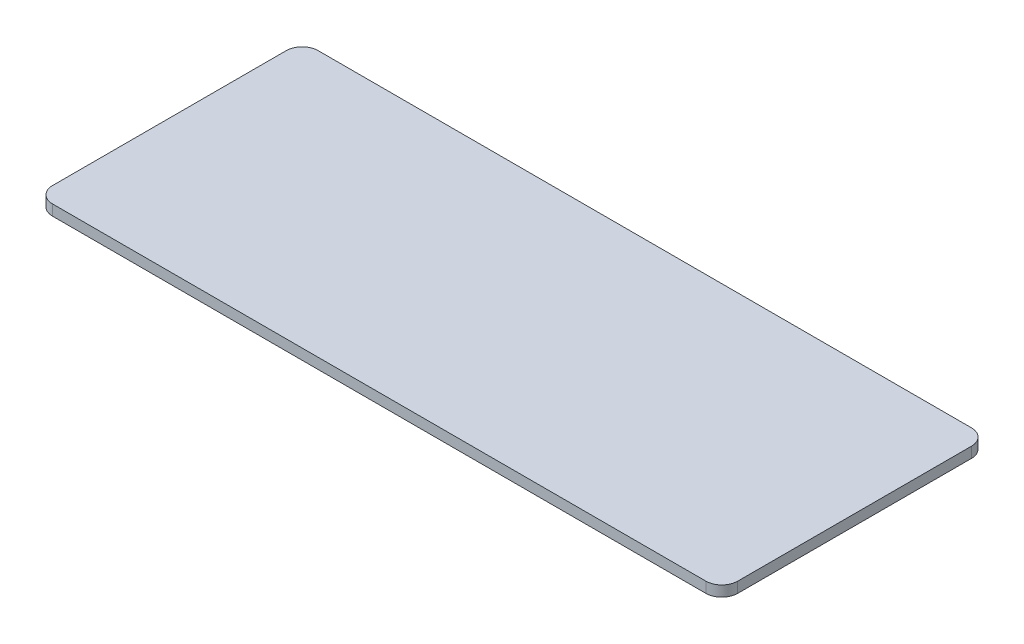
ISO-10303-21;
HEADER;
FILE_DESCRIPTION(('STEP AP214'),'2;1');
FILE_NAME('part.step','',(''),(''),'','','');
FILE_SCHEMA(('AUTOMOTIVE_DESIGN { 1 0 10303 214 1 1 1 1 }'));
ENDSEC;
DATA;
#1=APPLICATION_CONTEXT('core data for automotive mechanical design processes');
#2=APPLICATION_PROTOCOL_DEFINITION('international standard','automotive_design',2000,#1);
#3=PRODUCT_CONTEXT('',#1,'mechanical');
#4=PRODUCT('Part','Part','',(#3));
#5=PRODUCT_RELATED_PRODUCT_CATEGORY('part','',(#4));
#6=PRODUCT_DEFINITION_FORMATION('','',#4);
#7=PRODUCT_DEFINITION_CONTEXT('part definition',#1,'design');
#8=PRODUCT_DEFINITION('design','',#6,#7);
#9=PRODUCT_DEFINITION_SHAPE('','',#8);
#10=(LENGTH_UNIT() NAMED_UNIT(*) SI_UNIT(.MILLI.,.METRE.));
#11=(NAMED_UNIT(*) PLANE_ANGLE_UNIT() SI_UNIT($,.RADIAN.));
#12=(NAMED_UNIT(*) SI_UNIT($,.STERADIAN.) SOLID_ANGLE_UNIT());
#13=UNCERTAINTY_MEASURE_WITH_UNIT(LENGTH_MEASURE(1.E-05),#10,'distance_accuracy_value','');
#14=(GEOMETRIC_REPRESENTATION_CONTEXT(3) GLOBAL_UNCERTAINTY_ASSIGNED_CONTEXT((#13)) GLOBAL_UNIT_ASSIGNED_CONTEXT((#10,
#11,#12)) REPRESENTATION_CONTEXT('',''));
#15=CARTESIAN_POINT('',(0.,0.,0.));
#16=DIRECTION('',(0.,0.,1.));
#17=DIRECTION('',(1.,0.,0.));
#18=AXIS2_PLACEMENT_3D('',#15,#16,#17);
#19=CARTESIAN_POINT('',(64.5,2.,25.));
#20=DIRECTION('',(-1.,0.,0.));
#21=DIRECTION('',(0.,0.,1.));
#22=AXIS2_PLACEMENT_3D('',#19,#20,#21);
#23=PLANE('',#22);
#24=DIRECTION('',(0.,0.,-1.));
#25=VECTOR('',#24,1.);
#26=CARTESIAN_POINT('',(64.5,0.,25.));
#27=LINE('',#26,#25);
#28=CARTESIAN_POINT('',(64.5,0.,22.));
#29=VERTEX_POINT('',#28);
#30=CARTESIAN_POINT('',(64.5,0.,-22.));
#31=VERTEX_POINT('',#30);
#32=EDGE_CURVE('E128',#29,#31,#27,.T.);
#33=ORIENTED_EDGE('',*,*,#32,.T.);
#34=DIRECTION('',(0.,-1.,0.));
#35=VECTOR('',#34,1.);
#36=CARTESIAN_POINT('',(64.5,2.,-22.));
#37=LINE('',#36,#35);
#38=CARTESIAN_POINT('',(64.5,2.,-22.));
#39=VERTEX_POINT('',#38);
#40=EDGE_CURVE('E151',#31,#39,#37,.F.);
#41=ORIENTED_EDGE('',*,*,#40,.T.);
#42=DIRECTION('',(0.,0.,-1.));
#43=VECTOR('',#42,1.);
#44=CARTESIAN_POINT('',(64.5,2.,25.));
#45=LINE('',#44,#43);
#46=CARTESIAN_POINT('',(64.5,2.,22.));
#47=VERTEX_POINT('',#46);
#48=EDGE_CURVE('E126',#47,#39,#45,.T.);
#49=ORIENTED_EDGE('',*,*,#48,.F.);
#50=DIRECTION('',(0.,-1.,0.));
#51=VECTOR('',#50,1.);
#52=CARTESIAN_POINT('',(64.5,2.,22.));
#53=LINE('',#52,#51);
#54=EDGE_CURVE('E148',#47,#29,#53,.T.);
#55=ORIENTED_EDGE('',*,*,#54,.T.);
#56=EDGE_LOOP('',(#33,#41,#49,#55));
#57=FACE_BOUND('',#56,.T.);
#58=ADVANCED_FACE('F33',(#57),#23,.F.);
#59=CARTESIAN_POINT('',(-64.5,2.,-25.));
#60=DIRECTION('',(0.,0.,1.));
#61=DIRECTION('',(1.,0.,0.));
#62=AXIS2_PLACEMENT_3D('',#59,#60,#61);
#63=PLANE('',#62);
#64=DIRECTION('',(-1.,0.,0.));
#65=VECTOR('',#64,1.);
#66=CARTESIAN_POINT('',(-64.5,0.,-25.));
#67=LINE('',#66,#65);
#68=CARTESIAN_POINT('',(61.5,0.,-25.));
#69=VERTEX_POINT('',#68);
#70=CARTESIAN_POINT('',(-61.5,0.,-25.));
#71=VERTEX_POINT('',#70);
#72=EDGE_CURVE('E124',#69,#71,#67,.T.);
#73=ORIENTED_EDGE('',*,*,#72,.T.);
#74=DIRECTION('',(0.,-1.,0.));
#75=VECTOR('',#74,1.);
#76=CARTESIAN_POINT('',(-61.5,2.,-25.));
#77=LINE('',#76,#75);
#78=CARTESIAN_POINT('',(-61.5,2.,-25.));
#79=VERTEX_POINT('',#78);
#80=EDGE_CURVE('E103',#71,#79,#77,.F.);
#81=ORIENTED_EDGE('',*,*,#80,.T.);
#82=DIRECTION('',(-1.,0.,0.));
#83=VECTOR('',#82,1.);
#84=CARTESIAN_POINT('',(-64.5,2.,-25.));
#85=LINE('',#84,#83);
#86=CARTESIAN_POINT('',(61.5,2.,-25.));
#87=VERTEX_POINT('',#86);
#88=EDGE_CURVE('E167',#87,#79,#85,.T.);
#89=ORIENTED_EDGE('',*,*,#88,.F.);
#90=DIRECTION('',(0.,-1.,0.));
#91=VECTOR('',#90,1.);
#92=CARTESIAN_POINT('',(61.5,2.,-25.));
#93=LINE('',#92,#91);
#94=EDGE_CURVE('E108',#87,#69,#93,.T.);
#95=ORIENTED_EDGE('',*,*,#94,.T.);
#96=EDGE_LOOP('',(#73,#81,#89,#95));
#97=FACE_BOUND('',#96,.T.);
#98=ADVANCED_FACE('F184',(#97),#63,.F.);
#99=CARTESIAN_POINT('',(-64.5,2.,25.));
#100=DIRECTION('',(1.,0.,0.));
#101=DIRECTION('',(0.,0.,-1.));
#102=AXIS2_PLACEMENT_3D('',#99,#100,#101);
#103=PLANE('',#102);
#104=DIRECTION('',(0.,0.,1.));
#105=VECTOR('',#104,1.);
#106=CARTESIAN_POINT('',(-64.5,2.,25.));
#107=LINE('',#106,#105);
#108=CARTESIAN_POINT('',(-64.5,2.,-22.));
#109=VERTEX_POINT('',#108);
#110=CARTESIAN_POINT('',(-64.5,2.,22.));
#111=VERTEX_POINT('',#110);
#112=EDGE_CURVE('E117',#109,#111,#107,.T.);
#113=ORIENTED_EDGE('',*,*,#112,.F.);
#114=DIRECTION('',(0.,-1.,0.));
#115=VECTOR('',#114,1.);
#116=CARTESIAN_POINT('',(-64.5,2.,-22.));
#117=LINE('',#116,#115);
#118=CARTESIAN_POINT('',(-64.5,0.,-22.));
#119=VERTEX_POINT('',#118);
#120=EDGE_CURVE('E102',#109,#119,#117,.T.);
#121=ORIENTED_EDGE('',*,*,#120,.T.);
#122=DIRECTION('',(0.,0.,1.));
#123=VECTOR('',#122,1.);
#124=CARTESIAN_POINT('',(-64.5,0.,25.));
#125=LINE('',#124,#123);
#126=CARTESIAN_POINT('',(-64.5,0.,22.));
#127=VERTEX_POINT('',#126);
#128=EDGE_CURVE('E115',#119,#127,#125,.T.);
#129=ORIENTED_EDGE('',*,*,#128,.T.);
#130=DIRECTION('',(0.,-1.,0.));
#131=VECTOR('',#130,1.);
#132=CARTESIAN_POINT('',(-64.5,2.,22.));
#133=LINE('',#132,#131);
#134=EDGE_CURVE('E119',#127,#111,#133,.F.);
#135=ORIENTED_EDGE('',*,*,#134,.T.);
#136=EDGE_LOOP('',(#113,#121,#129,#135));
#137=FACE_BOUND('',#136,.T.);
#138=ADVANCED_FACE('F114',(#137),#103,.F.);
#139=CARTESIAN_POINT('',(-64.5,2.,25.));
#140=DIRECTION('',(0.,0.,-1.));
#141=DIRECTION('',(-1.,0.,0.));
#142=AXIS2_PLACEMENT_3D('',#139,#140,#141);
#143=PLANE('',#142);
#144=DIRECTION('',(1.,0.,0.));
#145=VECTOR('',#144,1.);
#146=CARTESIAN_POINT('',(-64.5,0.,25.));
#147=LINE('',#146,#145);
#148=CARTESIAN_POINT('',(-61.5,0.,25.));
#149=VERTEX_POINT('',#148);
#150=CARTESIAN_POINT('',(61.5,0.,25.));
#151=VERTEX_POINT('',#150);
#152=EDGE_CURVE('E123',#149,#151,#147,.T.);
#153=ORIENTED_EDGE('',*,*,#152,.T.);
#154=DIRECTION('',(0.,-1.,0.));
#155=VECTOR('',#154,1.);
#156=CARTESIAN_POINT('',(61.5,2.,25.));
#157=LINE('',#156,#155);
#158=CARTESIAN_POINT('',(61.5,2.,25.));
#159=VERTEX_POINT('',#158);
#160=EDGE_CURVE('E11',#151,#159,#157,.F.);
#161=ORIENTED_EDGE('',*,*,#160,.T.);
#162=DIRECTION('',(1.,0.,0.));
#163=VECTOR('',#162,1.);
#164=CARTESIAN_POINT('',(-64.5,2.,25.));
#165=LINE('',#164,#163);
#166=CARTESIAN_POINT('',(-61.5,2.,25.));
#167=VERTEX_POINT('',#166);
#168=EDGE_CURVE('E132',#167,#159,#165,.T.);
#169=ORIENTED_EDGE('',*,*,#168,.F.);
#170=DIRECTION('',(0.,-1.,0.));
#171=VECTOR('',#170,1.);
#172=CARTESIAN_POINT('',(-61.5,2.,25.));
#173=LINE('',#172,#171);
#174=EDGE_CURVE('E41',#167,#149,#173,.T.);
#175=ORIENTED_EDGE('',*,*,#174,.T.);
#176=EDGE_LOOP('',(#153,#161,#169,#175));
#177=FACE_BOUND('',#176,.T.);
#178=ADVANCED_FACE('F154',(#177),#143,.F.);
#179=CARTESIAN_POINT('',(0.,2.,0.));
#180=DIRECTION('',(0.,-1.,0.));
#181=DIRECTION('',(0.,0.,-1.));
#182=AXIS2_PLACEMENT_3D('',#179,#180,#181);
#183=PLANE('',#182);
#184=ORIENTED_EDGE('',*,*,#88,.T.);
#185=CARTESIAN_POINT('',(-61.5,2.,-22.));
#186=DIRECTION('',(0.,-1.,0.));
#187=DIRECTION('',(0.,0.,-1.));
#188=AXIS2_PLACEMENT_3D('',#185,#186,#187);
#189=CIRCLE('',#188,3.);
#190=EDGE_CURVE('E146',#79,#109,#189,.F.);
#191=ORIENTED_EDGE('',*,*,#190,.T.);
#192=ORIENTED_EDGE('',*,*,#112,.T.);
#193=CARTESIAN_POINT('',(-61.5,2.,22.));
#194=DIRECTION('',(0.,-1.,0.));
#195=DIRECTION('',(0.,0.,-1.));
#196=AXIS2_PLACEMENT_3D('',#193,#194,#195);
#197=CIRCLE('',#196,3.);
#198=EDGE_CURVE('E53',#111,#167,#197,.F.);
#199=ORIENTED_EDGE('',*,*,#198,.T.);
#200=ORIENTED_EDGE('',*,*,#168,.T.);
#201=CARTESIAN_POINT('',(61.5,2.,22.));
#202=DIRECTION('',(0.,-1.,0.));
#203=DIRECTION('',(0.,0.,-1.));
#204=AXIS2_PLACEMENT_3D('',#201,#202,#203);
#205=CIRCLE('',#204,3.);
#206=EDGE_CURVE('E142',#159,#47,#205,.F.);
#207=ORIENTED_EDGE('',*,*,#206,.T.);
#208=ORIENTED_EDGE('',*,*,#48,.T.);
#209=CARTESIAN_POINT('',(61.5,2.,-22.));
#210=DIRECTION('',(0.,-1.,0.));
#211=DIRECTION('',(0.,0.,-1.));
#212=AXIS2_PLACEMENT_3D('',#209,#210,#211);
#213=CIRCLE('',#212,3.);
#214=EDGE_CURVE('E144',#39,#87,#213,.F.);
#215=ORIENTED_EDGE('',*,*,#214,.T.);
#216=EDGE_LOOP('',(#184,#191,#192,#199,#200,#207,#208,#215));
#217=FACE_BOUND('',#216,.T.);
#218=ADVANCED_FACE('F173',(#217),#183,.F.);
#219=CARTESIAN_POINT('',(0.,0.,0.));
#220=DIRECTION('',(0.,-1.,0.));
#221=DIRECTION('',(0.,0.,-1.));
#222=AXIS2_PLACEMENT_3D('',#219,#220,#221);
#223=PLANE('',#222);
#224=ORIENTED_EDGE('',*,*,#128,.F.);
#225=CARTESIAN_POINT('',(-61.5,0.,-22.));
#226=DIRECTION('',(0.,-1.,0.));
#227=DIRECTION('',(0.,0.,-1.));
#228=AXIS2_PLACEMENT_3D('',#225,#226,#227);
#229=CIRCLE('',#228,3.);
#230=EDGE_CURVE('E98',#119,#71,#229,.T.);
#231=ORIENTED_EDGE('',*,*,#230,.T.);
#232=ORIENTED_EDGE('',*,*,#72,.F.);
#233=CARTESIAN_POINT('',(61.5,0.,-22.));
#234=DIRECTION('',(0.,-1.,0.));
#235=DIRECTION('',(0.,0.,-1.));
#236=AXIS2_PLACEMENT_3D('',#233,#234,#235);
#237=CIRCLE('',#236,3.);
#238=EDGE_CURVE('E109',#69,#31,#237,.T.);
#239=ORIENTED_EDGE('',*,*,#238,.T.);
#240=ORIENTED_EDGE('',*,*,#32,.F.);
#241=CARTESIAN_POINT('',(61.5,0.,22.));
#242=DIRECTION('',(0.,-1.,0.));
#243=DIRECTION('',(0.,0.,-1.));
#244=AXIS2_PLACEMENT_3D('',#241,#242,#243);
#245=CIRCLE('',#244,3.);
#246=EDGE_CURVE('E135',#29,#151,#245,.T.);
#247=ORIENTED_EDGE('',*,*,#246,.T.);
#248=ORIENTED_EDGE('',*,*,#152,.F.);
#249=CARTESIAN_POINT('',(-61.5,0.,22.));
#250=DIRECTION('',(0.,-1.,0.));
#251=DIRECTION('',(0.,0.,-1.));
#252=AXIS2_PLACEMENT_3D('',#249,#250,#251);
#253=CIRCLE('',#252,3.);
#254=EDGE_CURVE('E118',#149,#127,#253,.T.);
#255=ORIENTED_EDGE('',*,*,#254,.T.);
#256=EDGE_LOOP('',(#224,#231,#232,#239,#240,#247,#248,#255));
#257=FACE_BOUND('',#256,.T.);
#258=ADVANCED_FACE('F121',(#257),#223,.T.);
#259=CARTESIAN_POINT('',(-61.5,2.,-22.));
#260=DIRECTION('',(0.,-1.,0.));
#261=DIRECTION('',(0.,0.,-1.));
#262=AXIS2_PLACEMENT_3D('',#259,#260,#261);
#263=CYLINDRICAL_SURFACE('',#262,3.);
#264=ORIENTED_EDGE('',*,*,#190,.F.);
#265=ORIENTED_EDGE('',*,*,#80,.F.);
#266=ORIENTED_EDGE('',*,*,#230,.F.);
#267=ORIENTED_EDGE('',*,*,#120,.F.);
#268=EDGE_LOOP('',(#264,#265,#266,#267));
#269=FACE_BOUND('',#268,.T.);
#270=ADVANCED_FACE('F101',(#269),#263,.T.);
#271=CARTESIAN_POINT('',(61.5,2.,-22.));
#272=DIRECTION('',(0.,-1.,0.));
#273=DIRECTION('',(0.,0.,-1.));
#274=AXIS2_PLACEMENT_3D('',#271,#272,#273);
#275=CYLINDRICAL_SURFACE('',#274,3.);
#276=ORIENTED_EDGE('',*,*,#214,.F.);
#277=ORIENTED_EDGE('',*,*,#40,.F.);
#278=ORIENTED_EDGE('',*,*,#238,.F.);
#279=ORIENTED_EDGE('',*,*,#94,.F.);
#280=EDGE_LOOP('',(#276,#277,#278,#279));
#281=FACE_BOUND('',#280,.T.);
#282=ADVANCED_FACE('F195',(#281),#275,.T.);
#283=CARTESIAN_POINT('',(61.5,2.,22.));
#284=DIRECTION('',(0.,-1.,0.));
#285=DIRECTION('',(0.,0.,-1.));
#286=AXIS2_PLACEMENT_3D('',#283,#284,#285);
#287=CYLINDRICAL_SURFACE('',#286,3.);
#288=ORIENTED_EDGE('',*,*,#206,.F.);
#289=ORIENTED_EDGE('',*,*,#160,.F.);
#290=ORIENTED_EDGE('',*,*,#246,.F.);
#291=ORIENTED_EDGE('',*,*,#54,.F.);
#292=EDGE_LOOP('',(#288,#289,#290,#291));
#293=FACE_BOUND('',#292,.T.);
#294=ADVANCED_FACE('F161',(#293),#287,.T.);
#295=CARTESIAN_POINT('',(-61.5,2.,22.));
#296=DIRECTION('',(0.,-1.,0.));
#297=DIRECTION('',(0.,0.,-1.));
#298=AXIS2_PLACEMENT_3D('',#295,#296,#297);
#299=CYLINDRICAL_SURFACE('',#298,3.);
#300=ORIENTED_EDGE('',*,*,#198,.F.);
#301=ORIENTED_EDGE('',*,*,#134,.F.);
#302=ORIENTED_EDGE('',*,*,#254,.F.);
#303=ORIENTED_EDGE('',*,*,#174,.F.);
#304=EDGE_LOOP('',(#300,#301,#302,#303));
#305=FACE_BOUND('',#304,.T.);
#306=ADVANCED_FACE('F35',(#305),#299,.T.);
#307=CLOSED_SHELL('',(#58,#98,#138,#178,#218,#258,#270,#282,#294,#306));
#308=MANIFOLD_SOLID_BREP('B2',#307);
#309=ADVANCED_BREP_SHAPE_REPRESENTATION('',(#18,#308),#14);
#310=SHAPE_DEFINITION_REPRESENTATION(#9,#309);
ENDSEC;
END-ISO-10303-21;
